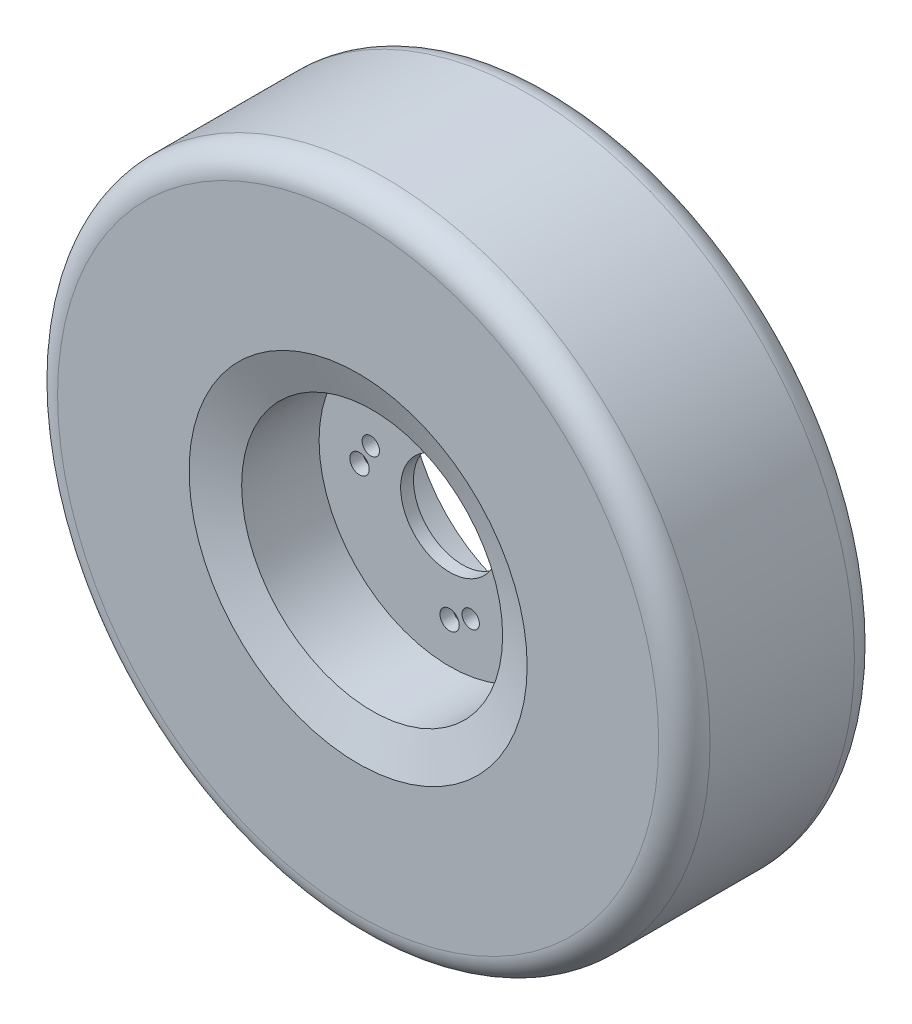
ISO-10303-21;
HEADER;
FILE_DESCRIPTION(('STEP AP214'),'2;1');
FILE_NAME('part.step','',(''),(''),'','','');
FILE_SCHEMA(('AUTOMOTIVE_DESIGN { 1 0 10303 214 1 1 1 1 }'));
ENDSEC;
DATA;
#1=APPLICATION_CONTEXT('core data for automotive mechanical design processes');
#2=APPLICATION_PROTOCOL_DEFINITION('international standard','automotive_design',2000,#1);
#3=PRODUCT_CONTEXT('',#1,'mechanical');
#4=PRODUCT('Part','Part','',(#3));
#5=PRODUCT_RELATED_PRODUCT_CATEGORY('part','',(#4));
#6=PRODUCT_DEFINITION_FORMATION('','',#4);
#7=PRODUCT_DEFINITION_CONTEXT('part definition',#1,'design');
#8=PRODUCT_DEFINITION('design','',#6,#7);
#9=PRODUCT_DEFINITION_SHAPE('','',#8);
#10=(LENGTH_UNIT() NAMED_UNIT(*) SI_UNIT(.MILLI.,.METRE.));
#11=(NAMED_UNIT(*) PLANE_ANGLE_UNIT() SI_UNIT($,.RADIAN.));
#12=(NAMED_UNIT(*) SI_UNIT($,.STERADIAN.) SOLID_ANGLE_UNIT());
#13=UNCERTAINTY_MEASURE_WITH_UNIT(LENGTH_MEASURE(1.E-05),#10,'distance_accuracy_value','');
#14=(GEOMETRIC_REPRESENTATION_CONTEXT(3) GLOBAL_UNCERTAINTY_ASSIGNED_CONTEXT((#13)) GLOBAL_UNIT_ASSIGNED_CONTEXT((#10,
#11,#12)) REPRESENTATION_CONTEXT('',''));
#15=CARTESIAN_POINT('',(0.,0.,0.));
#16=DIRECTION('',(0.,0.,1.));
#17=DIRECTION('',(1.,0.,0.));
#18=AXIS2_PLACEMENT_3D('',#15,#16,#17);
#19=CARTESIAN_POINT('',(0.,0.,38.1));
#20=DIRECTION('',(0.,0.,-1.));
#21=DIRECTION('',(-1.,0.,0.));
#22=AXIS2_PLACEMENT_3D('',#19,#20,#21);
#23=CYLINDRICAL_SURFACE('',#22,50.8);
#24=CARTESIAN_POINT('',(0.,0.,-32.6404464860069));
#25=DIRECTION('',(0.,0.,1.));
#26=DIRECTION('',(1.,0.,0.));
#27=AXIS2_PLACEMENT_3D('',#24,#25,#26);
#28=CIRCLE('',#27,50.8);
#29=CARTESIAN_POINT('',(-50.8,0.,-32.6404464860069));
#30=VERTEX_POINT('',#29);
#31=EDGE_CURVE('E58',#30,#30,#28,.F.);
#32=CARTESIAN_POINT('',(0.,0.,-2.5));
#33=DIRECTION('',(0.,0.,1.));
#34=DIRECTION('',(1.,0.,0.));
#35=AXIS2_PLACEMENT_3D('',#32,#33,#34);
#36=CIRCLE('',#35,50.8);
#37=CARTESIAN_POINT('',(-50.8,0.,-2.5));
#38=VERTEX_POINT('',#37);
#39=EDGE_CURVE('E67',#38,#38,#36,.T.);
#40=CARTESIAN_POINT('',(-50.8,0.,-32.6404464860069));
#41=CARTESIAN_POINT('',(-50.8,0.,-32.3264835017777));
#42=CARTESIAN_POINT('',(-50.8,0.,-32.0125205175484));
#43=CARTESIAN_POINT('',(-50.8,0.,-31.38459454909));
#44=CARTESIAN_POINT('',(-50.8,0.,-31.0706315648607));
#45=CARTESIAN_POINT('',(-50.8,0.,-30.4427055964023));
#46=CARTESIAN_POINT('',(-50.8,0.,-30.128742612173));
#47=CARTESIAN_POINT('',(-50.8,0.,-29.5008166437145));
#48=CARTESIAN_POINT('',(-50.8,0.,-29.1868536594853));
#49=CARTESIAN_POINT('',(-50.8,0.,-28.5589276910268));
#50=CARTESIAN_POINT('',(-50.8,0.,-28.2449647067976));
#51=CARTESIAN_POINT('',(-50.8,0.,-27.6170387383391));
#52=CARTESIAN_POINT('',(-50.8,0.,-27.3030757541099));
#53=CARTESIAN_POINT('',(-50.8,0.,-26.6751497856514));
#54=CARTESIAN_POINT('',(-50.8,0.,-26.3611868014221));
#55=CARTESIAN_POINT('',(-50.8,0.,-25.7332608329637));
#56=CARTESIAN_POINT('',(-50.8,0.,-25.4192978487344));
#57=CARTESIAN_POINT('',(-50.8,0.,-24.791371880276));
#58=CARTESIAN_POINT('',(-50.8,0.,-24.4774088960467));
#59=CARTESIAN_POINT('',(-50.8,0.,-23.8494829275882));
#60=CARTESIAN_POINT('',(-50.8,0.,-23.535519943359));
#61=CARTESIAN_POINT('',(-50.8,0.,-22.9075939749005));
#62=CARTESIAN_POINT('',(-50.8,0.,-22.5936309906713));
#63=CARTESIAN_POINT('',(-50.8,0.,-21.9657050222128));
#64=CARTESIAN_POINT('',(-50.8,0.,-21.6517420379836));
#65=CARTESIAN_POINT('',(-50.8,0.,-21.0238160695251));
#66=CARTESIAN_POINT('',(-50.8,0.,-20.7098530852959));
#67=CARTESIAN_POINT('',(-50.8,0.,-20.0819271168374));
#68=CARTESIAN_POINT('',(-50.8,0.,-19.7679641326081));
#69=CARTESIAN_POINT('',(-50.8,0.,-19.1400381641497));
#70=CARTESIAN_POINT('',(-50.8,0.,-18.8260751799204));
#71=CARTESIAN_POINT('',(-50.8,0.,-18.1981492114619));
#72=CARTESIAN_POINT('',(-50.8,0.,-17.8841862272327));
#73=CARTESIAN_POINT('',(-50.8,0.,-17.2562602587742));
#74=CARTESIAN_POINT('',(-50.8,0.,-16.942297274545));
#75=CARTESIAN_POINT('',(-50.8,0.,-16.3143713060865));
#76=CARTESIAN_POINT('',(-50.8,0.,-16.0004083218573));
#77=CARTESIAN_POINT('',(-50.8,0.,-15.3724823533988));
#78=CARTESIAN_POINT('',(-50.8,0.,-15.0585193691696));
#79=CARTESIAN_POINT('',(-50.8,0.,-14.4305934007111));
#80=CARTESIAN_POINT('',(-50.8,0.,-14.1166304164818));
#81=CARTESIAN_POINT('',(-50.8,0.,-13.4887044480234));
#82=CARTESIAN_POINT('',(-50.8,0.,-13.1747414637941));
#83=CARTESIAN_POINT('',(-50.8,0.,-12.5468154953356));
#84=CARTESIAN_POINT('',(-50.8,0.,-12.2328525111064));
#85=CARTESIAN_POINT('',(-50.8,0.,-11.6049265426479));
#86=CARTESIAN_POINT('',(-50.8,0.,-11.2909635584187));
#87=CARTESIAN_POINT('',(-50.8,0.,-10.6630375899602));
#88=CARTESIAN_POINT('',(-50.8,0.,-10.349074605731));
#89=CARTESIAN_POINT('',(-50.8,0.,-9.7211486372725));
#90=CARTESIAN_POINT('',(-50.8,0.,-9.40718565304326));
#91=CARTESIAN_POINT('',(-50.8,0.,-8.77925968458478));
#92=CARTESIAN_POINT('',(-50.8,0.,-8.46529670035554));
#93=CARTESIAN_POINT('',(-50.8,0.,-7.83737073189706));
#94=CARTESIAN_POINT('',(-50.8,0.,-7.52340774766782));
#95=CARTESIAN_POINT('',(-50.8,0.,-6.89548177920935));
#96=CARTESIAN_POINT('',(-50.8,0.,-6.58151879498011));
#97=CARTESIAN_POINT('',(-50.8,0.,-5.95359282652163));
#98=CARTESIAN_POINT('',(-50.8,0.,-5.63962984229239));
#99=CARTESIAN_POINT('',(-50.8,0.,-5.01170387383391));
#100=CARTESIAN_POINT('',(-50.8,0.,-4.69774088960467));
#101=CARTESIAN_POINT('',(-50.8,0.,-4.06981492114619));
#102=CARTESIAN_POINT('',(-50.8,0.,-3.75585193691696));
#103=CARTESIAN_POINT('',(-50.8,0.,-3.12792596845848));
#104=CARTESIAN_POINT('',(-50.8,0.,-2.81396298422924));
#105=CARTESIAN_POINT('',(-50.8,0.,-2.5));
#106=B_SPLINE_CURVE_WITH_KNOTS('',3,(#40,#41,#42,#43,#44,#45,#46,#47,#48,#49,#50,#51,#52,#53,
#54,#55,#56,#57,#58,#59,#60,#61,#62,#63,#64,#65,#66,#67,#68,#69,#70,#71,#72,#73,#74,#75,#76,#77,
#78,#79,#80,#81,#82,#83,#84,#85,#86,#87,#88,#89,#90,#91,#92,#93,#94,#95,#96,#97,#98,#99,#100,
#101,#102,#103,#104,#105),.UNSPECIFIED.,.F.,.F.,(4,2,2,2,2,2,2,2,2,2,2,2,2,2,2,2,2,2,2,2,2,2,2,
2,2,2,2,2,2,2,2,2,4),(0.,0.941888952687722,1.88377790537543,2.82566685806315,3.76755581075086,
4.70944476343858,5.65133371612631,6.59322266881401,7.53511162150174,8.47700057418944,
9.41888952687716,10.3607784795649,11.3026674322526,12.2445563849403,13.186445337628,
14.1283342903157,15.0702232430035,16.0121121956912,16.9540011483789,17.8958901010666,
18.8377790537543,19.779668006442,20.7215569591298,21.6634459118175,22.6053348645052,
23.5472238171929,24.4891127698806,25.4310017225683,26.3728906752561,27.3147796279438,
28.2566685806315,29.1985575333192,30.1404464860069),.UNSPECIFIED.);
#107=EDGE_CURVE('BSEAM32',#30,#38,#106,.T.);
#108=ORIENTED_EDGE('',*,*,#31,.T.);
#109=ORIENTED_EDGE('',*,*,#39,.T.);
#110=ORIENTED_EDGE('',*,*,#107,.T.);
#111=ORIENTED_EDGE('',*,*,#107,.F.);
#112=EDGE_LOOP('',(#108,#110,#109,#111));
#113=FACE_BOUND('',#112,.T.);
#114=ADVANCED_FACE('F32',(#113),#23,.F.);
#115=CARTESIAN_POINT('',(0.,0.,38.1));
#116=DIRECTION('',(0.,0.,1.));
#117=DIRECTION('',(1.,0.,0.));
#118=AXIS2_PLACEMENT_3D('',#115,#116,#117);
#119=PLANE('',#118);
#120=CARTESIAN_POINT('',(0.,0.,38.1));
#121=DIRECTION('',(0.,0.,1.));
#122=DIRECTION('',(1.,0.,0.));
#123=AXIS2_PLACEMENT_3D('',#120,#121,#122);
#124=CIRCLE('',#123,117.);
#125=CARTESIAN_POINT('',(117.,0.,38.1));
#126=VERTEX_POINT('',#125);
#127=EDGE_CURVE('E40',#126,#126,#124,.T.);
#128=ORIENTED_EDGE('',*,*,#127,.T.);
#129=EDGE_LOOP('',(#128));
#130=FACE_BOUND('',#129,.T.);
#131=CARTESIAN_POINT('',(0.,0.,38.1));
#132=DIRECTION('',(0.,0.,1.));
#133=DIRECTION('',(1.,0.,0.));
#134=AXIS2_PLACEMENT_3D('',#131,#132,#133);
#135=CIRCLE('',#134,65.8000000000003);
#136=CARTESIAN_POINT('',(65.8000000000003,0.,38.1));
#137=VERTEX_POINT('',#136);
#138=EDGE_CURVE('E55',#137,#137,#135,.F.);
#139=ORIENTED_EDGE('',*,*,#138,.T.);
#140=EDGE_LOOP('',(#139));
#141=FACE_BOUND('',#140,.T.);
#142=ADVANCED_FACE('F153',(#130,#141),#119,.T.);
#143=CARTESIAN_POINT('',(0.,0.,-38.1));
#144=DIRECTION('',(0.,0.,1.));
#145=DIRECTION('',(1.,0.,0.));
#146=AXIS2_PLACEMENT_3D('',#143,#144,#145);
#147=PLANE('',#146);
#148=CARTESIAN_POINT('',(0.,0.,-38.1));
#149=DIRECTION('',(0.,0.,1.));
#150=DIRECTION('',(1.,0.,0.));
#151=AXIS2_PLACEMENT_3D('',#148,#149,#150);
#152=CIRCLE('',#151,117.);
#153=CARTESIAN_POINT('',(117.,0.,-38.1));
#154=VERTEX_POINT('',#153);
#155=EDGE_CURVE('E44',#154,#154,#152,.F.);
#156=ORIENTED_EDGE('',*,*,#155,.T.);
#157=EDGE_LOOP('',(#156));
#158=FACE_BOUND('',#157,.T.);
#159=CARTESIAN_POINT('',(0.,0.,-38.1));
#160=DIRECTION('',(0.,0.,1.));
#161=DIRECTION('',(1.,0.,0.));
#162=AXIS2_PLACEMENT_3D('',#159,#160,#161);
#163=CIRCLE('',#162,65.8000000000003);
#164=CARTESIAN_POINT('',(65.8000000000003,0.,-38.1));
#165=VERTEX_POINT('',#164);
#166=EDGE_CURVE('E64',#165,#165,#163,.T.);
#167=ORIENTED_EDGE('',*,*,#166,.T.);
#168=EDGE_LOOP('',(#167));
#169=FACE_BOUND('',#168,.T.);
#170=ADVANCED_FACE('F159',(#158,#169),#147,.F.);
#171=CARTESIAN_POINT('',(0.,0.,38.1));
#172=DIRECTION('',(0.,0.,-1.));
#173=DIRECTION('',(-1.,0.,0.));
#174=AXIS2_PLACEMENT_3D('',#171,#172,#173);
#175=CYLINDRICAL_SURFACE('',#174,127.);
#176=CARTESIAN_POINT('',(0.,0.,-28.1));
#177=DIRECTION('',(0.,0.,1.));
#178=DIRECTION('',(1.,0.,0.));
#179=AXIS2_PLACEMENT_3D('',#176,#177,#178);
#180=CIRCLE('',#179,127.);
#181=CARTESIAN_POINT('',(-127.,0.,-28.1));
#182=VERTEX_POINT('',#181);
#183=EDGE_CURVE('E49',#182,#182,#180,.T.);
#184=CARTESIAN_POINT('',(0.,0.,28.1));
#185=DIRECTION('',(0.,0.,1.));
#186=DIRECTION('',(1.,0.,0.));
#187=AXIS2_PLACEMENT_3D('',#184,#185,#186);
#188=CIRCLE('',#187,127.);
#189=CARTESIAN_POINT('',(-127.,0.,28.1));
#190=VERTEX_POINT('',#189);
#191=EDGE_CURVE('E52',#190,#190,#188,.F.);
#192=CARTESIAN_POINT('',(-127.,0.,-28.1));
#193=CARTESIAN_POINT('',(-127.,0.,-27.5145833333334));
#194=CARTESIAN_POINT('',(-127.,0.,-26.9291666666667));
#195=CARTESIAN_POINT('',(-127.,0.,-25.7583333333334));
#196=CARTESIAN_POINT('',(-127.,0.,-25.1729166666667));
#197=CARTESIAN_POINT('',(-127.,0.,-24.0020833333334));
#198=CARTESIAN_POINT('',(-127.,0.,-23.4166666666667));
#199=CARTESIAN_POINT('',(-127.,0.,-22.2458333333334));
#200=CARTESIAN_POINT('',(-127.,0.,-21.6604166666667));
#201=CARTESIAN_POINT('',(-127.,0.,-20.4895833333334));
#202=CARTESIAN_POINT('',(-127.,0.,-19.9041666666667));
#203=CARTESIAN_POINT('',(-127.,0.,-18.7333333333334));
#204=CARTESIAN_POINT('',(-127.,0.,-18.1479166666667));
#205=CARTESIAN_POINT('',(-127.,0.,-16.9770833333334));
#206=CARTESIAN_POINT('',(-127.,0.,-16.3916666666667));
#207=CARTESIAN_POINT('',(-127.,0.,-15.2208333333334));
#208=CARTESIAN_POINT('',(-127.,0.,-14.6354166666667));
#209=CARTESIAN_POINT('',(-127.,0.,-13.4645833333334));
#210=CARTESIAN_POINT('',(-127.,0.,-12.8791666666667));
#211=CARTESIAN_POINT('',(-127.,0.,-11.7083333333334));
#212=CARTESIAN_POINT('',(-127.,0.,-11.1229166666667));
#213=CARTESIAN_POINT('',(-127.,0.,-9.95208333333335));
#214=CARTESIAN_POINT('',(-127.,0.,-9.36666666666668));
#215=CARTESIAN_POINT('',(-127.,0.,-8.19583333333335));
#216=CARTESIAN_POINT('',(-127.,0.,-7.61041666666668));
#217=CARTESIAN_POINT('',(-127.,0.,-6.43958333333335));
#218=CARTESIAN_POINT('',(-127.,0.,-5.85416666666668));
#219=CARTESIAN_POINT('',(-127.,0.,-4.68333333333335));
#220=CARTESIAN_POINT('',(-127.,0.,-4.09791666666668));
#221=CARTESIAN_POINT('',(-127.,0.,-2.92708333333335));
#222=CARTESIAN_POINT('',(-127.,0.,-2.34166666666668));
#223=CARTESIAN_POINT('',(-127.,0.,-1.17083333333335));
#224=CARTESIAN_POINT('',(-127.,0.,-0.585416666666681));
#225=CARTESIAN_POINT('',(-127.,0.,0.585416666666653));
#226=CARTESIAN_POINT('',(-127.,0.,1.17083333333332));
#227=CARTESIAN_POINT('',(-127.,0.,2.34166666666665));
#228=CARTESIAN_POINT('',(-127.,0.,2.92708333333332));
#229=CARTESIAN_POINT('',(-127.,0.,4.09791666666665));
#230=CARTESIAN_POINT('',(-127.,0.,4.68333333333332));
#231=CARTESIAN_POINT('',(-127.,0.,5.85416666666665));
#232=CARTESIAN_POINT('',(-127.,0.,6.43958333333332));
#233=CARTESIAN_POINT('',(-127.,0.,7.61041666666665));
#234=CARTESIAN_POINT('',(-127.,0.,8.19583333333332));
#235=CARTESIAN_POINT('',(-127.,0.,9.36666666666665));
#236=CARTESIAN_POINT('',(-127.,0.,9.95208333333332));
#237=CARTESIAN_POINT('',(-127.,0.,11.1229166666667));
#238=CARTESIAN_POINT('',(-127.,0.,11.7083333333333));
#239=CARTESIAN_POINT('',(-127.,0.,12.8791666666667));
#240=CARTESIAN_POINT('',(-127.,0.,13.4645833333333));
#241=CARTESIAN_POINT('',(-127.,0.,14.6354166666667));
#242=CARTESIAN_POINT('',(-127.,0.,15.2208333333333));
#243=CARTESIAN_POINT('',(-127.,0.,16.3916666666667));
#244=CARTESIAN_POINT('',(-127.,0.,16.9770833333333));
#245=CARTESIAN_POINT('',(-127.,0.,18.1479166666667));
#246=CARTESIAN_POINT('',(-127.,0.,18.7333333333333));
#247=CARTESIAN_POINT('',(-127.,0.,19.9041666666667));
#248=CARTESIAN_POINT('',(-127.,0.,20.4895833333333));
#249=CARTESIAN_POINT('',(-127.,0.,21.6604166666667));
#250=CARTESIAN_POINT('',(-127.,0.,22.2458333333333));
#251=CARTESIAN_POINT('',(-127.,0.,23.4166666666667));
#252=CARTESIAN_POINT('',(-127.,0.,24.0020833333333));
#253=CARTESIAN_POINT('',(-127.,0.,25.1729166666667));
#254=CARTESIAN_POINT('',(-127.,0.,25.7583333333333));
#255=CARTESIAN_POINT('',(-127.,0.,26.9291666666667));
#256=CARTESIAN_POINT('',(-127.,0.,27.5145833333333));
#257=CARTESIAN_POINT('',(-127.,0.,28.1));
#258=B_SPLINE_CURVE_WITH_KNOTS('',3,(#192,#193,#194,#195,#196,#197,#198,#199,#200,#201,#202,
#203,#204,#205,#206,#207,#208,#209,#210,#211,#212,#213,#214,#215,#216,#217,#218,#219,#220,#221,
#222,#223,#224,#225,#226,#227,#228,#229,#230,#231,#232,#233,#234,#235,#236,#237,#238,#239,#240,
#241,#242,#243,#244,#245,#246,#247,#248,#249,#250,#251,#252,#253,#254,#255,#256,#257),
.UNSPECIFIED.,.F.,.F.,(4,2,2,2,2,2,2,2,2,2,2,2,2,2,2,2,2,2,2,2,2,2,2,2,2,2,2,2,2,2,2,2,4),(0.,
1.75625,3.5125,5.26875,7.025,8.78125,10.5375,12.29375,14.05,15.80625,17.5625,19.31875,21.075,
22.83125,24.5875,26.34375,28.1,29.85625,31.6125,33.36875,35.125,36.88125,38.6375,40.39375,42.15,
43.90625,45.6625,47.41875,49.175,50.93125,52.6875,54.44375,56.2),.UNSPECIFIED.);
#259=EDGE_CURVE('BSEAM165',#182,#190,#258,.T.);
#260=ORIENTED_EDGE('',*,*,#183,.T.);
#261=ORIENTED_EDGE('',*,*,#191,.T.);
#262=ORIENTED_EDGE('',*,*,#259,.T.);
#263=ORIENTED_EDGE('',*,*,#259,.F.);
#264=EDGE_LOOP('',(#260,#262,#261,#263));
#265=FACE_BOUND('',#264,.T.);
#266=ADVANCED_FACE('F165',(#265),#175,.T.);
#267=CARTESIAN_POINT('',(0.,0.,2.5));
#268=DIRECTION('',(0.,0.,1.));
#269=DIRECTION('',(1.,0.,0.));
#270=AXIS2_PLACEMENT_3D('',#267,#268,#269);
#271=CIRCLE('',#270,50.8);
#272=CARTESIAN_POINT('',(-50.8,0.,2.5));
#273=VERTEX_POINT('',#272);
#274=EDGE_CURVE('E10',#273,#273,#271,.T.);
#275=CARTESIAN_POINT('',(0.,0.,32.6404464860069));
#276=DIRECTION('',(0.,0.,1.));
#277=DIRECTION('',(1.,0.,0.));
#278=AXIS2_PLACEMENT_3D('',#275,#276,#277);
#279=CIRCLE('',#278,50.8);
#280=CARTESIAN_POINT('',(-50.8,0.,32.6404464860069));
#281=VERTEX_POINT('',#280);
#282=EDGE_CURVE('E61',#281,#281,#279,.T.);
#283=CARTESIAN_POINT('',(-50.8,0.,2.5));
#284=CARTESIAN_POINT('',(-50.8,0.,2.81396298422924));
#285=CARTESIAN_POINT('',(-50.8,0.,3.12792596845848));
#286=CARTESIAN_POINT('',(-50.8,0.,3.75585193691696));
#287=CARTESIAN_POINT('',(-50.8,0.,4.06981492114619));
#288=CARTESIAN_POINT('',(-50.8,0.,4.69774088960467));
#289=CARTESIAN_POINT('',(-50.8,0.,5.01170387383391));
#290=CARTESIAN_POINT('',(-50.8,0.,5.63962984229239));
#291=CARTESIAN_POINT('',(-50.8,0.,5.95359282652162));
#292=CARTESIAN_POINT('',(-50.8,0.,6.5815187949801));
#293=CARTESIAN_POINT('',(-50.8,0.,6.89548177920934));
#294=CARTESIAN_POINT('',(-50.8,0.,7.52340774766782));
#295=CARTESIAN_POINT('',(-50.8,0.,7.83737073189706));
#296=CARTESIAN_POINT('',(-50.8,0.,8.46529670035554));
#297=CARTESIAN_POINT('',(-50.8,0.,8.77925968458477));
#298=CARTESIAN_POINT('',(-50.8,0.,9.40718565304325));
#299=CARTESIAN_POINT('',(-50.8,0.,9.72114863727249));
#300=CARTESIAN_POINT('',(-50.8,0.,10.349074605731));
#301=CARTESIAN_POINT('',(-50.8,0.,10.6630375899602));
#302=CARTESIAN_POINT('',(-50.8,0.,11.2909635584187));
#303=CARTESIAN_POINT('',(-50.8,0.,11.6049265426479));
#304=CARTESIAN_POINT('',(-50.8,0.,12.2328525111064));
#305=CARTESIAN_POINT('',(-50.8,0.,12.5468154953356));
#306=CARTESIAN_POINT('',(-50.8,0.,13.1747414637941));
#307=CARTESIAN_POINT('',(-50.8,0.,13.4887044480234));
#308=CARTESIAN_POINT('',(-50.8,0.,14.1166304164818));
#309=CARTESIAN_POINT('',(-50.8,0.,14.4305934007111));
#310=CARTESIAN_POINT('',(-50.8,0.,15.0585193691695));
#311=CARTESIAN_POINT('',(-50.8,0.,15.3724823533988));
#312=CARTESIAN_POINT('',(-50.8,0.,16.0004083218573));
#313=CARTESIAN_POINT('',(-50.8,0.,16.3143713060865));
#314=CARTESIAN_POINT('',(-50.8,0.,16.942297274545));
#315=CARTESIAN_POINT('',(-50.8,0.,17.2562602587742));
#316=CARTESIAN_POINT('',(-50.8,0.,17.8841862272327));
#317=CARTESIAN_POINT('',(-50.8,0.,18.1981492114619));
#318=CARTESIAN_POINT('',(-50.8,0.,18.8260751799204));
#319=CARTESIAN_POINT('',(-50.8,0.,19.1400381641497));
#320=CARTESIAN_POINT('',(-50.8,0.,19.7679641326081));
#321=CARTESIAN_POINT('',(-50.8,0.,20.0819271168374));
#322=CARTESIAN_POINT('',(-50.8,0.,20.7098530852958));
#323=CARTESIAN_POINT('',(-50.8,0.,21.0238160695251));
#324=CARTESIAN_POINT('',(-50.8,0.,21.6517420379836));
#325=CARTESIAN_POINT('',(-50.8,0.,21.9657050222128));
#326=CARTESIAN_POINT('',(-50.8,0.,22.5936309906713));
#327=CARTESIAN_POINT('',(-50.8,0.,22.9075939749005));
#328=CARTESIAN_POINT('',(-50.8,0.,23.535519943359));
#329=CARTESIAN_POINT('',(-50.8,0.,23.8494829275882));
#330=CARTESIAN_POINT('',(-50.8,0.,24.4774088960467));
#331=CARTESIAN_POINT('',(-50.8,0.,24.7913718802759));
#332=CARTESIAN_POINT('',(-50.8,0.,25.4192978487344));
#333=CARTESIAN_POINT('',(-50.8,0.,25.7332608329637));
#334=CARTESIAN_POINT('',(-50.8,0.,26.3611868014221));
#335=CARTESIAN_POINT('',(-50.8,0.,26.6751497856514));
#336=CARTESIAN_POINT('',(-50.8,0.,27.3030757541099));
#337=CARTESIAN_POINT('',(-50.8,0.,27.6170387383391));
#338=CARTESIAN_POINT('',(-50.8,0.,28.2449647067976));
#339=CARTESIAN_POINT('',(-50.8,0.,28.5589276910268));
#340=CARTESIAN_POINT('',(-50.8,0.,29.1868536594853));
#341=CARTESIAN_POINT('',(-50.8,0.,29.5008166437145));
#342=CARTESIAN_POINT('',(-50.8,0.,30.128742612173));
#343=CARTESIAN_POINT('',(-50.8,0.,30.4427055964022));
#344=CARTESIAN_POINT('',(-50.8,0.,31.0706315648607));
#345=CARTESIAN_POINT('',(-50.8,0.,31.38459454909));
#346=CARTESIAN_POINT('',(-50.8,0.,32.0125205175484));
#347=CARTESIAN_POINT('',(-50.8,0.,32.3264835017777));
#348=CARTESIAN_POINT('',(-50.8,0.,32.6404464860069));
#349=B_SPLINE_CURVE_WITH_KNOTS('',3,(#283,#284,#285,#286,#287,#288,#289,#290,#291,#292,#293,
#294,#295,#296,#297,#298,#299,#300,#301,#302,#303,#304,#305,#306,#307,#308,#309,#310,#311,#312,
#313,#314,#315,#316,#317,#318,#319,#320,#321,#322,#323,#324,#325,#326,#327,#328,#329,#330,#331,
#332,#333,#334,#335,#336,#337,#338,#339,#340,#341,#342,#343,#344,#345,#346,#347,#348),
.UNSPECIFIED.,.F.,.F.,(4,2,2,2,2,2,2,2,2,2,2,2,2,2,2,2,2,2,2,2,2,2,2,2,2,2,2,2,2,2,2,2,4),(0.,
0.941888952687715,1.88377790537543,2.82566685806315,3.76755581075086,4.70944476343858,
5.6513337161263,6.59322266881401,7.53511162150173,8.47700057418944,9.41888952687716,
10.3607784795649,11.3026674322526,12.2445563849403,13.186445337628,14.1283342903157,
15.0702232430035,16.0121121956912,16.9540011483789,17.8958901010666,18.8377790537543,
19.779668006442,20.7215569591297,21.6634459118175,22.6053348645052,23.5472238171929,
24.4891127698806,25.4310017225683,26.372890675256,27.3147796279438,28.2566685806315,
29.1985575333192,30.1404464860069),.UNSPECIFIED.);
#350=EDGE_CURVE('BSEAM155',#273,#281,#349,.T.);
#351=ORIENTED_EDGE('',*,*,#274,.F.);
#352=ORIENTED_EDGE('',*,*,#282,.T.);
#353=ORIENTED_EDGE('',*,*,#350,.T.);
#354=ORIENTED_EDGE('',*,*,#350,.F.);
#355=EDGE_LOOP('',(#351,#353,#352,#354));
#356=FACE_BOUND('',#355,.T.);
#357=ADVANCED_FACE('F155',(#356),#23,.F.);
#358=CARTESIAN_POINT('',(0.,0.,-38.1));
#359=DIRECTION('',(0.,0.,-1.));
#360=DIRECTION('',(-1.,0.,0.));
#361=AXIS2_PLACEMENT_3D('',#358,#359,#360);
#362=CONICAL_SURFACE('',#361,65.8000000000003,1.22173047639603);
#363=ORIENTED_EDGE('',*,*,#31,.F.);
#364=EDGE_LOOP('',(#363));
#365=FACE_BOUND('',#364,.T.);
#366=ORIENTED_EDGE('',*,*,#166,.F.);
#367=EDGE_LOOP('',(#366));
#368=FACE_BOUND('',#367,.T.);
#369=ADVANCED_FACE('F164',(#365,#368),#362,.F.);
#370=CARTESIAN_POINT('',(0.,0.,32.6404464860069));
#371=DIRECTION('',(0.,0.,1.));
#372=DIRECTION('',(1.,0.,0.));
#373=AXIS2_PLACEMENT_3D('',#370,#371,#372);
#374=CONICAL_SURFACE('',#373,50.8,1.22173047639603);
#375=ORIENTED_EDGE('',*,*,#138,.F.);
#376=EDGE_LOOP('',(#375));
#377=FACE_BOUND('',#376,.T.);
#378=ORIENTED_EDGE('',*,*,#282,.F.);
#379=EDGE_LOOP('',(#378));
#380=FACE_BOUND('',#379,.T.);
#381=ADVANCED_FACE('F171',(#377,#380),#374,.F.);
#382=CARTESIAN_POINT('',(0.,0.,-28.1));
#383=DIRECTION('',(0.,0.,1.));
#384=DIRECTION('',(1.,0.,0.));
#385=AXIS2_PLACEMENT_3D('',#382,#383,#384);
#386=TOROIDAL_SURFACE('',#385,117.,10.);
#387=ORIENTED_EDGE('',*,*,#155,.F.);
#388=EDGE_LOOP('',(#387));
#389=FACE_BOUND('',#388,.T.);
#390=ORIENTED_EDGE('',*,*,#183,.F.);
#391=EDGE_LOOP('',(#390));
#392=FACE_BOUND('',#391,.T.);
#393=ADVANCED_FACE('F180',(#389,#392),#386,.T.);
#394=CARTESIAN_POINT('',(0.,0.,28.1));
#395=DIRECTION('',(0.,0.,1.));
#396=DIRECTION('',(1.,0.,0.));
#397=AXIS2_PLACEMENT_3D('',#394,#395,#396);
#398=TOROIDAL_SURFACE('',#397,117.,10.);
#399=ORIENTED_EDGE('',*,*,#191,.F.);
#400=EDGE_LOOP('',(#399));
#401=FACE_BOUND('',#400,.T.);
#402=ORIENTED_EDGE('',*,*,#127,.F.);
#403=EDGE_LOOP('',(#402));
#404=FACE_BOUND('',#403,.T.);
#405=ADVANCED_FACE('F34',(#401,#404),#398,.T.);
#406=CARTESIAN_POINT('',(0.,0.,2.5));
#407=DIRECTION('',(0.,0.,1.));
#408=DIRECTION('',(1.,0.,0.));
#409=AXIS2_PLACEMENT_3D('',#406,#407,#408);
#410=PLANE('',#409);
#411=CARTESIAN_POINT('',(-30.6681449846779,8.21750468200504,2.5));
#412=DIRECTION('',(0.,0.,1.));
#413=DIRECTION('',(1.,0.,0.));
#414=AXIS2_PLACEMENT_3D('',#411,#412,#413);
#415=CIRCLE('',#414,3.3782);
#416=CARTESIAN_POINT('',(-27.2899449846779,8.21750468200504,2.5));
#417=VERTEX_POINT('',#416);
#418=EDGE_CURVE('E112',#417,#417,#415,.T.);
#419=ORIENTED_EDGE('',*,*,#418,.F.);
#420=EDGE_LOOP('',(#419));
#421=FACE_BOUND('',#420,.T.);
#422=CARTESIAN_POINT('',(22.4506403026728,22.4506403026729,2.5));
#423=DIRECTION('',(0.,0.,1.));
#424=DIRECTION('',(1.,0.,0.));
#425=AXIS2_PLACEMENT_3D('',#422,#423,#424);
#426=CIRCLE('',#425,3.3782);
#427=CARTESIAN_POINT('',(25.8288403026728,22.4506403026729,2.5));
#428=VERTEX_POINT('',#427);
#429=EDGE_CURVE('E106',#428,#428,#426,.T.);
#430=ORIENTED_EDGE('',*,*,#429,.F.);
#431=EDGE_LOOP('',(#430));
#432=FACE_BOUND('',#431,.T.);
#433=CARTESIAN_POINT('',(8.21750468200496,-30.6681449846779,2.5));
#434=DIRECTION('',(0.,0.,1.));
#435=DIRECTION('',(1.,0.,0.));
#436=AXIS2_PLACEMENT_3D('',#433,#434,#435);
#437=CIRCLE('',#436,3.3782);
#438=CARTESIAN_POINT('',(11.595704682005,-30.6681449846779,2.5));
#439=VERTEX_POINT('',#438);
#440=EDGE_CURVE('E100',#439,#439,#437,.T.);
#441=ORIENTED_EDGE('',*,*,#440,.F.);
#442=EDGE_LOOP('',(#441));
#443=FACE_BOUND('',#442,.T.);
#444=CARTESIAN_POINT('',(0.,35.052,2.5));
#445=DIRECTION('',(0.,0.,1.));
#446=DIRECTION('',(1.,0.,0.));
#447=AXIS2_PLACEMENT_3D('',#444,#445,#446);
#448=CIRCLE('',#447,3.770376);
#449=CARTESIAN_POINT('',(3.770376,35.052,2.5));
#450=VERTEX_POINT('',#449);
#451=EDGE_CURVE('E94',#450,#450,#448,.T.);
#452=ORIENTED_EDGE('',*,*,#451,.F.);
#453=EDGE_LOOP('',(#452));
#454=FACE_BOUND('',#453,.T.);
#455=CARTESIAN_POINT('',(35.052,0.,2.5));
#456=DIRECTION('',(0.,0.,1.));
#457=DIRECTION('',(1.,0.,0.));
#458=AXIS2_PLACEMENT_3D('',#455,#456,#457);
#459=CIRCLE('',#458,3.770376);
#460=CARTESIAN_POINT('',(38.822376,0.,2.5));
#461=VERTEX_POINT('',#460);
#462=EDGE_CURVE('E88',#461,#461,#459,.T.);
#463=ORIENTED_EDGE('',*,*,#462,.F.);
#464=EDGE_LOOP('',(#463));
#465=FACE_BOUND('',#464,.T.);
#466=CARTESIAN_POINT('',(0.,-35.052,2.5));
#467=DIRECTION('',(0.,0.,1.));
#468=DIRECTION('',(1.,0.,0.));
#469=AXIS2_PLACEMENT_3D('',#466,#467,#468);
#470=CIRCLE('',#469,3.770376);
#471=CARTESIAN_POINT('',(3.770376,-35.052,2.5));
#472=VERTEX_POINT('',#471);
#473=EDGE_CURVE('E82',#472,#472,#470,.T.);
#474=ORIENTED_EDGE('',*,*,#473,.F.);
#475=EDGE_LOOP('',(#474));
#476=FACE_BOUND('',#475,.T.);
#477=CARTESIAN_POINT('',(-35.052,0.,2.5));
#478=DIRECTION('',(0.,0.,1.));
#479=DIRECTION('',(1.,0.,0.));
#480=AXIS2_PLACEMENT_3D('',#477,#478,#479);
#481=CIRCLE('',#480,3.770376);
#482=CARTESIAN_POINT('',(-31.281624,0.,2.5));
#483=VERTEX_POINT('',#482);
#484=EDGE_CURVE('E76',#483,#483,#481,.T.);
#485=ORIENTED_EDGE('',*,*,#484,.F.);
#486=EDGE_LOOP('',(#485));
#487=FACE_BOUND('',#486,.T.);
#488=ORIENTED_EDGE('',*,*,#274,.T.);
#489=EDGE_LOOP('',(#488));
#490=FACE_BOUND('',#489,.T.);
#491=CARTESIAN_POINT('',(0.,0.,2.5));
#492=DIRECTION('',(0.,0.,1.));
#493=DIRECTION('',(1.,0.,0.));
#494=AXIS2_PLACEMENT_3D('',#491,#492,#493);
#495=CIRCLE('',#494,19.05);
#496=CARTESIAN_POINT('',(19.05,0.,2.5));
#497=VERTEX_POINT('',#496);
#498=EDGE_CURVE('E70',#497,#497,#495,.T.);
#499=ORIENTED_EDGE('',*,*,#498,.F.);
#500=EDGE_LOOP('',(#499));
#501=FACE_BOUND('',#500,.T.);
#502=ADVANCED_FACE('F119',(#421,#432,#443,#454,#465,#476,#487,#490,#501),#410,.T.);
#503=CARTESIAN_POINT('',(0.,0.,-2.5));
#504=DIRECTION('',(0.,0.,1.));
#505=DIRECTION('',(1.,0.,0.));
#506=AXIS2_PLACEMENT_3D('',#503,#504,#505);
#507=PLANE('',#506);
#508=CARTESIAN_POINT('',(-30.6681449846779,8.21750468200504,-2.5));
#509=DIRECTION('',(0.,0.,1.));
#510=DIRECTION('',(1.,0.,0.));
#511=AXIS2_PLACEMENT_3D('',#508,#509,#510);
#512=CIRCLE('',#511,3.3782);
#513=CARTESIAN_POINT('',(-27.2899449846779,8.21750468200504,-2.5));
#514=VERTEX_POINT('',#513);
#515=EDGE_CURVE('E109',#514,#514,#512,.T.);
#516=ORIENTED_EDGE('',*,*,#515,.T.);
#517=EDGE_LOOP('',(#516));
#518=FACE_BOUND('',#517,.T.);
#519=CARTESIAN_POINT('',(22.4506403026728,22.4506403026729,-2.5));
#520=DIRECTION('',(0.,0.,1.));
#521=DIRECTION('',(1.,0.,0.));
#522=AXIS2_PLACEMENT_3D('',#519,#520,#521);
#523=CIRCLE('',#522,3.3782);
#524=CARTESIAN_POINT('',(25.8288403026728,22.4506403026729,-2.5));
#525=VERTEX_POINT('',#524);
#526=EDGE_CURVE('E103',#525,#525,#523,.T.);
#527=ORIENTED_EDGE('',*,*,#526,.T.);
#528=EDGE_LOOP('',(#527));
#529=FACE_BOUND('',#528,.T.);
#530=CARTESIAN_POINT('',(8.21750468200496,-30.6681449846779,-2.5));
#531=DIRECTION('',(0.,0.,1.));
#532=DIRECTION('',(1.,0.,0.));
#533=AXIS2_PLACEMENT_3D('',#530,#531,#532);
#534=CIRCLE('',#533,3.3782);
#535=CARTESIAN_POINT('',(11.595704682005,-30.6681449846779,-2.5));
#536=VERTEX_POINT('',#535);
#537=EDGE_CURVE('E97',#536,#536,#534,.T.);
#538=ORIENTED_EDGE('',*,*,#537,.T.);
#539=EDGE_LOOP('',(#538));
#540=FACE_BOUND('',#539,.T.);
#541=CARTESIAN_POINT('',(0.,35.052,-2.5));
#542=DIRECTION('',(0.,0.,1.));
#543=DIRECTION('',(1.,0.,0.));
#544=AXIS2_PLACEMENT_3D('',#541,#542,#543);
#545=CIRCLE('',#544,3.770376);
#546=CARTESIAN_POINT('',(3.770376,35.052,-2.5));
#547=VERTEX_POINT('',#546);
#548=EDGE_CURVE('E91',#547,#547,#545,.T.);
#549=ORIENTED_EDGE('',*,*,#548,.T.);
#550=EDGE_LOOP('',(#549));
#551=FACE_BOUND('',#550,.T.);
#552=CARTESIAN_POINT('',(35.052,0.,-2.5));
#553=DIRECTION('',(0.,0.,1.));
#554=DIRECTION('',(1.,0.,0.));
#555=AXIS2_PLACEMENT_3D('',#552,#553,#554);
#556=CIRCLE('',#555,3.770376);
#557=CARTESIAN_POINT('',(38.822376,0.,-2.5));
#558=VERTEX_POINT('',#557);
#559=EDGE_CURVE('E85',#558,#558,#556,.T.);
#560=ORIENTED_EDGE('',*,*,#559,.T.);
#561=EDGE_LOOP('',(#560));
#562=FACE_BOUND('',#561,.T.);
#563=CARTESIAN_POINT('',(0.,-35.052,-2.5));
#564=DIRECTION('',(0.,0.,1.));
#565=DIRECTION('',(1.,0.,0.));
#566=AXIS2_PLACEMENT_3D('',#563,#564,#565);
#567=CIRCLE('',#566,3.770376);
#568=CARTESIAN_POINT('',(3.770376,-35.052,-2.5));
#569=VERTEX_POINT('',#568);
#570=EDGE_CURVE('E79',#569,#569,#567,.T.);
#571=ORIENTED_EDGE('',*,*,#570,.T.);
#572=EDGE_LOOP('',(#571));
#573=FACE_BOUND('',#572,.T.);
#574=CARTESIAN_POINT('',(-35.052,0.,-2.5));
#575=DIRECTION('',(0.,0.,1.));
#576=DIRECTION('',(1.,0.,0.));
#577=AXIS2_PLACEMENT_3D('',#574,#575,#576);
#578=CIRCLE('',#577,3.770376);
#579=CARTESIAN_POINT('',(-31.281624,0.,-2.5));
#580=VERTEX_POINT('',#579);
#581=EDGE_CURVE('E36',#580,#580,#578,.T.);
#582=ORIENTED_EDGE('',*,*,#581,.T.);
#583=EDGE_LOOP('',(#582));
#584=FACE_BOUND('',#583,.T.);
#585=ORIENTED_EDGE('',*,*,#39,.F.);
#586=EDGE_LOOP('',(#585));
#587=FACE_BOUND('',#586,.T.);
#588=CARTESIAN_POINT('',(0.,0.,-2.5));
#589=DIRECTION('',(0.,0.,1.));
#590=DIRECTION('',(1.,0.,0.));
#591=AXIS2_PLACEMENT_3D('',#588,#589,#590);
#592=CIRCLE('',#591,19.05);
#593=CARTESIAN_POINT('',(19.05,0.,-2.5));
#594=VERTEX_POINT('',#593);
#595=EDGE_CURVE('E71',#594,#594,#592,.T.);
#596=ORIENTED_EDGE('',*,*,#595,.T.);
#597=EDGE_LOOP('',(#596));
#598=FACE_BOUND('',#597,.T.);
#599=ADVANCED_FACE('F122',(#518,#529,#540,#551,#562,#573,#584,#587,#598),#507,.F.);
#600=CARTESIAN_POINT('',(0.,0.,2.5));
#601=DIRECTION('',(0.,0.,-1.));
#602=DIRECTION('',(-1.,0.,0.));
#603=AXIS2_PLACEMENT_3D('',#600,#601,#602);
#604=CYLINDRICAL_SURFACE('',#603,19.05);
#605=ORIENTED_EDGE('',*,*,#498,.T.);
#606=EDGE_LOOP('',(#605));
#607=FACE_BOUND('',#606,.T.);
#608=ORIENTED_EDGE('',*,*,#595,.F.);
#609=EDGE_LOOP('',(#608));
#610=FACE_BOUND('',#609,.T.);
#611=ADVANCED_FACE('F138',(#607,#610),#604,.F.);
#612=CARTESIAN_POINT('',(-35.052,0.,2.5));
#613=DIRECTION('',(0.,0.,1.));
#614=DIRECTION('',(1.,0.,0.));
#615=AXIS2_PLACEMENT_3D('',#612,#613,#614);
#616=CYLINDRICAL_SURFACE('',#615,3.770376);
#617=ORIENTED_EDGE('',*,*,#484,.T.);
#618=EDGE_LOOP('',(#617));
#619=FACE_BOUND('',#618,.T.);
#620=ORIENTED_EDGE('',*,*,#581,.F.);
#621=EDGE_LOOP('',(#620));
#622=FACE_BOUND('',#621,.T.);
#623=ADVANCED_FACE('F141',(#619,#622),#616,.F.);
#624=CARTESIAN_POINT('',(0.,-35.052,2.5));
#625=DIRECTION('',(0.,0.,1.));
#626=DIRECTION('',(1.,0.,0.));
#627=AXIS2_PLACEMENT_3D('',#624,#625,#626);
#628=CYLINDRICAL_SURFACE('',#627,3.770376);
#629=ORIENTED_EDGE('',*,*,#473,.T.);
#630=EDGE_LOOP('',(#629));
#631=FACE_BOUND('',#630,.T.);
#632=ORIENTED_EDGE('',*,*,#570,.F.);
#633=EDGE_LOOP('',(#632));
#634=FACE_BOUND('',#633,.T.);
#635=ADVANCED_FACE('F265',(#631,#634),#628,.F.);
#636=CARTESIAN_POINT('',(35.052,0.,2.5));
#637=DIRECTION('',(0.,0.,1.));
#638=DIRECTION('',(1.,0.,0.));
#639=AXIS2_PLACEMENT_3D('',#636,#637,#638);
#640=CYLINDRICAL_SURFACE('',#639,3.770376);
#641=ORIENTED_EDGE('',*,*,#462,.T.);
#642=EDGE_LOOP('',(#641));
#643=FACE_BOUND('',#642,.T.);
#644=ORIENTED_EDGE('',*,*,#559,.F.);
#645=EDGE_LOOP('',(#644));
#646=FACE_BOUND('',#645,.T.);
#647=ADVANCED_FACE('F261',(#643,#646),#640,.F.);
#648=CARTESIAN_POINT('',(0.,35.052,2.5));
#649=DIRECTION('',(0.,0.,1.));
#650=DIRECTION('',(1.,0.,0.));
#651=AXIS2_PLACEMENT_3D('',#648,#649,#650);
#652=CYLINDRICAL_SURFACE('',#651,3.770376);
#653=ORIENTED_EDGE('',*,*,#451,.T.);
#654=EDGE_LOOP('',(#653));
#655=FACE_BOUND('',#654,.T.);
#656=ORIENTED_EDGE('',*,*,#548,.F.);
#657=EDGE_LOOP('',(#656));
#658=FACE_BOUND('',#657,.T.);
#659=ADVANCED_FACE('F222',(#655,#658),#652,.F.);
#660=CARTESIAN_POINT('',(8.21750468200496,-30.6681449846779,2.5));
#661=DIRECTION('',(0.,0.,1.));
#662=DIRECTION('',(1.,0.,0.));
#663=AXIS2_PLACEMENT_3D('',#660,#661,#662);
#664=CYLINDRICAL_SURFACE('',#663,3.3782);
#665=ORIENTED_EDGE('',*,*,#440,.T.);
#666=EDGE_LOOP('',(#665));
#667=FACE_BOUND('',#666,.T.);
#668=ORIENTED_EDGE('',*,*,#537,.F.);
#669=EDGE_LOOP('',(#668));
#670=FACE_BOUND('',#669,.T.);
#671=ADVANCED_FACE('F232',(#667,#670),#664,.F.);
#672=CARTESIAN_POINT('',(22.4506403026728,22.4506403026729,2.5));
#673=DIRECTION('',(0.,0.,1.));
#674=DIRECTION('',(1.,0.,0.));
#675=AXIS2_PLACEMENT_3D('',#672,#673,#674);
#676=CYLINDRICAL_SURFACE('',#675,3.3782);
#677=ORIENTED_EDGE('',*,*,#429,.T.);
#678=EDGE_LOOP('',(#677));
#679=FACE_BOUND('',#678,.T.);
#680=ORIENTED_EDGE('',*,*,#526,.F.);
#681=EDGE_LOOP('',(#680));
#682=FACE_BOUND('',#681,.T.);
#683=ADVANCED_FACE('F237',(#679,#682),#676,.F.);
#684=CARTESIAN_POINT('',(-30.6681449846779,8.21750468200504,2.5));
#685=DIRECTION('',(0.,0.,1.));
#686=DIRECTION('',(1.,0.,0.));
#687=AXIS2_PLACEMENT_3D('',#684,#685,#686);
#688=CYLINDRICAL_SURFACE('',#687,3.3782);
#689=ORIENTED_EDGE('',*,*,#418,.T.);
#690=EDGE_LOOP('',(#689));
#691=FACE_BOUND('',#690,.T.);
#692=ORIENTED_EDGE('',*,*,#515,.F.);
#693=EDGE_LOOP('',(#692));
#694=FACE_BOUND('',#693,.T.);
#695=ADVANCED_FACE('F116',(#691,#694),#688,.F.);
#696=CLOSED_SHELL('',(#114,#142,#170,#266,#357,#369,#381,#393,#405,#502,#599,#611,#623,#635,
#647,#659,#671,#683,#695));
#697=MANIFOLD_SOLID_BREP('B2',#696);
#698=ADVANCED_BREP_SHAPE_REPRESENTATION('',(#18,#697),#14);
#699=SHAPE_DEFINITION_REPRESENTATION(#9,#698);
ENDSEC;
END-ISO-10303-21;
